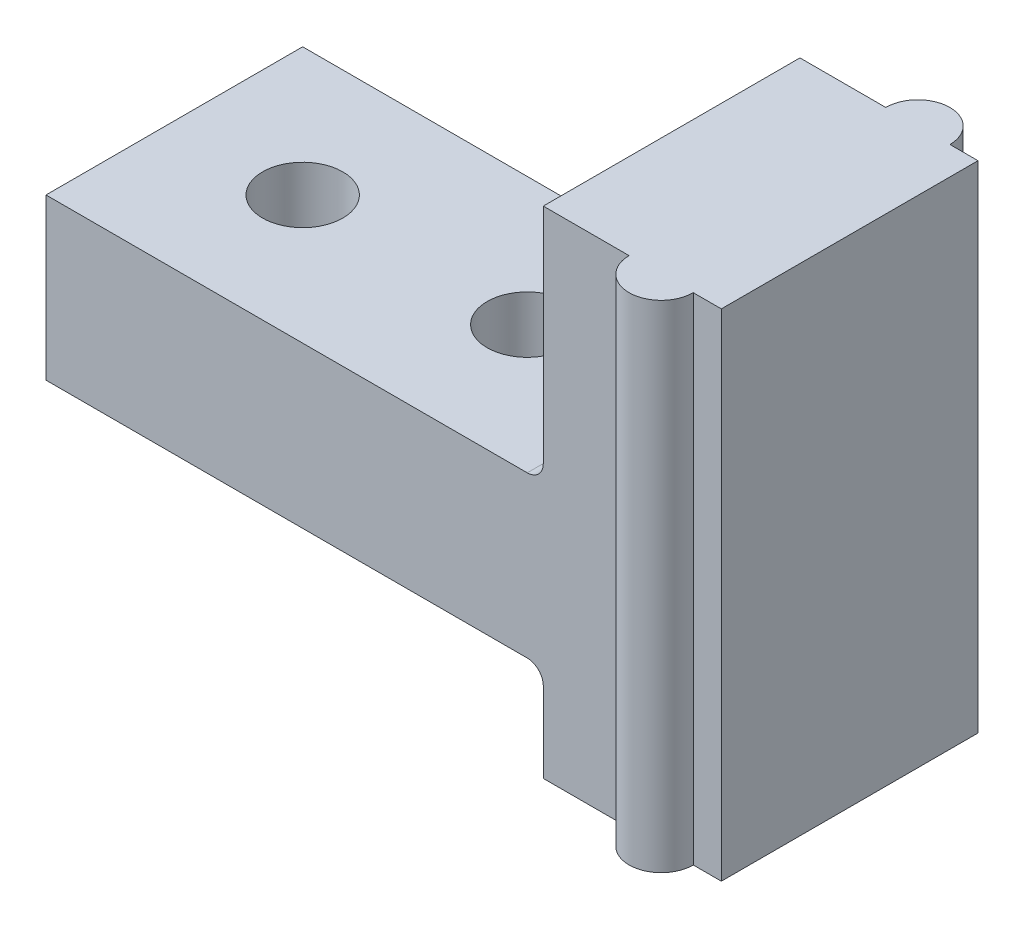
ISO-10303-21;
HEADER;
FILE_DESCRIPTION(('STEP AP214'),'2;1');
FILE_NAME('part.step','',(''),(''),'','','');
FILE_SCHEMA(('AUTOMOTIVE_DESIGN { 1 0 10303 214 1 1 1 1 }'));
ENDSEC;
DATA;
#1=APPLICATION_CONTEXT('core data for automotive mechanical design processes');
#2=APPLICATION_PROTOCOL_DEFINITION('international standard','automotive_design',2000,#1);
#3=PRODUCT_CONTEXT('',#1,'mechanical');
#4=PRODUCT('Part','Part','',(#3));
#5=PRODUCT_RELATED_PRODUCT_CATEGORY('part','',(#4));
#6=PRODUCT_DEFINITION_FORMATION('','',#4);
#7=PRODUCT_DEFINITION_CONTEXT('part definition',#1,'design');
#8=PRODUCT_DEFINITION('design','',#6,#7);
#9=PRODUCT_DEFINITION_SHAPE('','',#8);
#10=(LENGTH_UNIT() NAMED_UNIT(*) SI_UNIT(.MILLI.,.METRE.));
#11=(NAMED_UNIT(*) PLANE_ANGLE_UNIT() SI_UNIT($,.RADIAN.));
#12=(NAMED_UNIT(*) SI_UNIT($,.STERADIAN.) SOLID_ANGLE_UNIT());
#13=UNCERTAINTY_MEASURE_WITH_UNIT(LENGTH_MEASURE(1.E-05),#10,'distance_accuracy_value','');
#14=(GEOMETRIC_REPRESENTATION_CONTEXT(3) GLOBAL_UNCERTAINTY_ASSIGNED_CONTEXT((#13)) GLOBAL_UNIT_ASSIGNED_CONTEXT((#10,
#11,#12)) REPRESENTATION_CONTEXT('',''));
#15=CARTESIAN_POINT('',(0.,0.,0.));
#16=DIRECTION('',(0.,0.,1.));
#17=DIRECTION('',(1.,0.,0.));
#18=AXIS2_PLACEMENT_3D('',#15,#16,#17);
#19=CARTESIAN_POINT('',(-6.04999999999999,8.5,4.));
#20=DIRECTION('',(0.,0.,1.));
#21=DIRECTION('',(1.,0.,0.));
#22=AXIS2_PLACEMENT_3D('',#19,#20,#21);
#23=PLANE('',#22);
#24=DIRECTION('',(0.,-1.,0.));
#25=VECTOR('',#24,1.);
#26=CARTESIAN_POINT('',(-2.875,15.45,4.));
#27=LINE('',#26,#25);
#28=CARTESIAN_POINT('',(-2.875,15.45,4.));
#29=VERTEX_POINT('',#28);
#30=CARTESIAN_POINT('',(-2.875,0.,4.));
#31=VERTEX_POINT('',#30);
#32=EDGE_CURVE('E49',#29,#31,#27,.T.);
#33=ORIENTED_EDGE('',*,*,#32,.F.);
#34=DIRECTION('',(-1.,0.,0.));
#35=VECTOR('',#34,1.);
#36=CARTESIAN_POINT('',(-5.54999999999999,15.45,4.));
#37=LINE('',#36,#35);
#38=CARTESIAN_POINT('',(-5.54999999999999,15.45,4.));
#39=VERTEX_POINT('',#38);
#40=EDGE_CURVE('E174',#29,#39,#37,.T.);
#41=ORIENTED_EDGE('',*,*,#40,.T.);
#42=DIRECTION('',(0.,-1.,0.));
#43=VECTOR('',#42,1.);
#44=CARTESIAN_POINT('',(-5.54999999999999,8.5,4.));
#45=LINE('',#44,#43);
#46=CARTESIAN_POINT('',(-5.54999999999999,8.5,4.));
#47=VERTEX_POINT('',#46);
#48=EDGE_CURVE('E176',#39,#47,#45,.T.);
#49=ORIENTED_EDGE('',*,*,#48,.T.);
#50=CARTESIAN_POINT('',(-6.04999999999999,8.5,4.));
#51=DIRECTION('',(0.,0.,-1.));
#52=DIRECTION('',(1.,0.,0.));
#53=AXIS2_PLACEMENT_3D('',#50,#51,#52);
#54=CIRCLE('',#53,0.500000000000001);
#55=CARTESIAN_POINT('',(-6.04999999999999,8.,4.));
#56=VERTEX_POINT('',#55);
#57=EDGE_CURVE('E178',#47,#56,#54,.T.);
#58=ORIENTED_EDGE('',*,*,#57,.T.);
#59=DIRECTION('',(-1.,0.,0.));
#60=VECTOR('',#59,1.);
#61=CARTESIAN_POINT('',(-6.04999999999999,8.,4.));
#62=LINE('',#61,#60);
#63=CARTESIAN_POINT('',(-21.05,8.,4.));
#64=VERTEX_POINT('',#63);
#65=EDGE_CURVE('E180',#56,#64,#62,.T.);
#66=ORIENTED_EDGE('',*,*,#65,.T.);
#67=DIRECTION('',(0.,-1.,0.));
#68=VECTOR('',#67,1.);
#69=CARTESIAN_POINT('',(-21.05,3.,4.));
#70=LINE('',#69,#68);
#71=CARTESIAN_POINT('',(-21.05,3.,4.));
#72=VERTEX_POINT('',#71);
#73=EDGE_CURVE('E182',#64,#72,#70,.T.);
#74=ORIENTED_EDGE('',*,*,#73,.T.);
#75=DIRECTION('',(1.,0.,0.));
#76=VECTOR('',#75,1.);
#77=CARTESIAN_POINT('',(-6.04999999999999,3.,4.));
#78=LINE('',#77,#76);
#79=CARTESIAN_POINT('',(-6.04999999999999,3.,4.));
#80=VERTEX_POINT('',#79);
#81=EDGE_CURVE('E184',#72,#80,#78,.T.);
#82=ORIENTED_EDGE('',*,*,#81,.T.);
#83=CARTESIAN_POINT('',(-6.04999999999999,2.5,4.));
#84=DIRECTION('',(0.,0.,-1.));
#85=DIRECTION('',(-1.,0.,0.));
#86=AXIS2_PLACEMENT_3D('',#83,#84,#85);
#87=CIRCLE('',#86,0.500000000000003);
#88=CARTESIAN_POINT('',(-5.54999999999999,2.5,4.));
#89=VERTEX_POINT('',#88);
#90=EDGE_CURVE('E186',#80,#89,#87,.T.);
#91=ORIENTED_EDGE('',*,*,#90,.T.);
#92=DIRECTION('',(0.,-1.,0.));
#93=VECTOR('',#92,1.);
#94=CARTESIAN_POINT('',(-5.54999999999999,0.,4.));
#95=LINE('',#94,#93);
#96=CARTESIAN_POINT('',(-5.54999999999999,0.,4.));
#97=VERTEX_POINT('',#96);
#98=EDGE_CURVE('E188',#89,#97,#95,.T.);
#99=ORIENTED_EDGE('',*,*,#98,.T.);
#100=DIRECTION('',(1.,0.,0.));
#101=VECTOR('',#100,1.);
#102=CARTESIAN_POINT('',(-5.54999999999999,0.,4.));
#103=LINE('',#102,#101);
#104=EDGE_CURVE('E142',#97,#31,#103,.T.);
#105=ORIENTED_EDGE('',*,*,#104,.T.);
#106=EDGE_LOOP('',(#33,#41,#49,#58,#66,#74,#82,#91,#99,#105));
#107=FACE_BOUND('',#106,.T.);
#108=ADVANCED_FACE('F34',(#107),#23,.T.);
#109=CARTESIAN_POINT('',(-6.04999999999999,8.5,-4.));
#110=DIRECTION('',(0.,0.,1.));
#111=DIRECTION('',(1.,0.,0.));
#112=AXIS2_PLACEMENT_3D('',#109,#110,#111);
#113=PLANE('',#112);
#114=DIRECTION('',(-1.,0.,0.));
#115=VECTOR('',#114,1.);
#116=CARTESIAN_POINT('',(-5.54999999999999,15.45,-4.));
#117=LINE('',#116,#115);
#118=CARTESIAN_POINT('',(-2.875,15.45,-4.));
#119=VERTEX_POINT('',#118);
#120=CARTESIAN_POINT('',(-5.54999999999999,15.45,-4.));
#121=VERTEX_POINT('',#120);
#122=EDGE_CURVE('E195',#119,#121,#117,.T.);
#123=ORIENTED_EDGE('',*,*,#122,.F.);
#124=DIRECTION('',(0.,-1.,0.));
#125=VECTOR('',#124,1.);
#126=CARTESIAN_POINT('',(-2.875,15.45,-4.));
#127=LINE('',#126,#125);
#128=CARTESIAN_POINT('',(-2.875,0.,-4.));
#129=VERTEX_POINT('',#128);
#130=EDGE_CURVE('E166',#119,#129,#127,.T.);
#131=ORIENTED_EDGE('',*,*,#130,.T.);
#132=DIRECTION('',(1.,0.,0.));
#133=VECTOR('',#132,1.);
#134=CARTESIAN_POINT('',(-5.54999999999999,0.,-4.));
#135=LINE('',#134,#133);
#136=CARTESIAN_POINT('',(-5.54999999999999,0.,-4.));
#137=VERTEX_POINT('',#136);
#138=EDGE_CURVE('E191',#137,#129,#135,.T.);
#139=ORIENTED_EDGE('',*,*,#138,.F.);
#140=DIRECTION('',(0.,-1.,0.));
#141=VECTOR('',#140,1.);
#142=CARTESIAN_POINT('',(-5.54999999999999,0.,-4.));
#143=LINE('',#142,#141);
#144=CARTESIAN_POINT('',(-5.54999999999999,2.5,-4.));
#145=VERTEX_POINT('',#144);
#146=EDGE_CURVE('E143',#145,#137,#143,.T.);
#147=ORIENTED_EDGE('',*,*,#146,.F.);
#148=CARTESIAN_POINT('',(-6.04999999999999,2.5,-4.));
#149=DIRECTION('',(0.,0.,-1.));
#150=DIRECTION('',(-1.,0.,0.));
#151=AXIS2_PLACEMENT_3D('',#148,#149,#150);
#152=CIRCLE('',#151,0.500000000000003);
#153=CARTESIAN_POINT('',(-6.04999999999999,3.,-4.));
#154=VERTEX_POINT('',#153);
#155=EDGE_CURVE('E209',#154,#145,#152,.T.);
#156=ORIENTED_EDGE('',*,*,#155,.F.);
#157=DIRECTION('',(1.,0.,0.));
#158=VECTOR('',#157,1.);
#159=CARTESIAN_POINT('',(-6.04999999999999,3.,-4.));
#160=LINE('',#159,#158);
#161=CARTESIAN_POINT('',(-21.05,3.,-4.));
#162=VERTEX_POINT('',#161);
#163=EDGE_CURVE('E207',#162,#154,#160,.T.);
#164=ORIENTED_EDGE('',*,*,#163,.F.);
#165=DIRECTION('',(0.,-1.,0.));
#166=VECTOR('',#165,1.);
#167=CARTESIAN_POINT('',(-21.05,3.,-4.));
#168=LINE('',#167,#166);
#169=CARTESIAN_POINT('',(-21.05,8.,-4.));
#170=VERTEX_POINT('',#169);
#171=EDGE_CURVE('E205',#170,#162,#168,.T.);
#172=ORIENTED_EDGE('',*,*,#171,.F.);
#173=DIRECTION('',(-1.,0.,0.));
#174=VECTOR('',#173,1.);
#175=CARTESIAN_POINT('',(-6.04999999999999,8.,-4.));
#176=LINE('',#175,#174);
#177=CARTESIAN_POINT('',(-6.04999999999999,8.,-4.));
#178=VERTEX_POINT('',#177);
#179=EDGE_CURVE('E203',#178,#170,#176,.T.);
#180=ORIENTED_EDGE('',*,*,#179,.F.);
#181=CARTESIAN_POINT('',(-6.04999999999999,8.5,-4.));
#182=DIRECTION('',(0.,0.,-1.));
#183=DIRECTION('',(1.,0.,0.));
#184=AXIS2_PLACEMENT_3D('',#181,#182,#183);
#185=CIRCLE('',#184,0.500000000000001);
#186=CARTESIAN_POINT('',(-5.54999999999999,8.5,-4.));
#187=VERTEX_POINT('',#186);
#188=EDGE_CURVE('E201',#187,#178,#185,.T.);
#189=ORIENTED_EDGE('',*,*,#188,.F.);
#190=DIRECTION('',(0.,-1.,0.));
#191=VECTOR('',#190,1.);
#192=CARTESIAN_POINT('',(-5.54999999999999,8.5,-4.));
#193=LINE('',#192,#191);
#194=EDGE_CURVE('E199',#121,#187,#193,.T.);
#195=ORIENTED_EDGE('',*,*,#194,.F.);
#196=EDGE_LOOP('',(#123,#131,#139,#147,#156,#164,#172,#180,#189,#195));
#197=FACE_BOUND('',#196,.T.);
#198=ADVANCED_FACE('F252',(#197),#113,.F.);
#199=CARTESIAN_POINT('',(-5.54999999999999,0.,4.));
#200=DIRECTION('',(0.,1.,0.));
#201=DIRECTION('',(0.,0.,1.));
#202=AXIS2_PLACEMENT_3D('',#199,#200,#201);
#203=PLANE('',#202);
#204=ORIENTED_EDGE('',*,*,#138,.T.);
#205=CARTESIAN_POINT('',(-1.875,0.,-4.));
#206=DIRECTION('',(0.,-1.,0.));
#207=DIRECTION('',(0.,0.,1.));
#208=AXIS2_PLACEMENT_3D('',#205,#206,#207);
#209=CIRCLE('',#208,1.);
#210=CARTESIAN_POINT('',(-0.874999999999999,0.,-4.));
#211=VERTEX_POINT('',#210);
#212=EDGE_CURVE('E150',#129,#211,#209,.T.);
#213=ORIENTED_EDGE('',*,*,#212,.T.);
#214=CARTESIAN_POINT('',(0.,0.,-4.));
#215=VERTEX_POINT('',#214);
#216=EDGE_CURVE('E169',#211,#215,#135,.T.);
#217=ORIENTED_EDGE('',*,*,#216,.T.);
#218=DIRECTION('',(0.,0.,-1.));
#219=VECTOR('',#218,1.);
#220=CARTESIAN_POINT('',(0.,0.,4.));
#221=LINE('',#220,#219);
#222=CARTESIAN_POINT('',(0.,0.,4.));
#223=VERTEX_POINT('',#222);
#224=EDGE_CURVE('E11',#223,#215,#221,.T.);
#225=ORIENTED_EDGE('',*,*,#224,.F.);
#226=CARTESIAN_POINT('',(-0.875,0.,4.));
#227=VERTEX_POINT('',#226);
#228=EDGE_CURVE('E136',#227,#223,#103,.T.);
#229=ORIENTED_EDGE('',*,*,#228,.F.);
#230=CARTESIAN_POINT('',(-1.875,0.,4.));
#231=DIRECTION('',(0.,-1.,0.));
#232=DIRECTION('',(0.,0.,-1.));
#233=AXIS2_PLACEMENT_3D('',#230,#231,#232);
#234=CIRCLE('',#233,1.);
#235=EDGE_CURVE('E140',#227,#31,#234,.T.);
#236=ORIENTED_EDGE('',*,*,#235,.T.);
#237=ORIENTED_EDGE('',*,*,#104,.F.);
#238=DIRECTION('',(0.,0.,-1.));
#239=VECTOR('',#238,1.);
#240=CARTESIAN_POINT('',(-5.54999999999999,0.,4.));
#241=LINE('',#240,#239);
#242=EDGE_CURVE('E190',#97,#137,#241,.T.);
#243=ORIENTED_EDGE('',*,*,#242,.T.);
#244=EDGE_LOOP('',(#204,#213,#217,#225,#229,#236,#237,#243));
#245=FACE_BOUND('',#244,.T.);
#246=ADVANCED_FACE('F36',(#245),#203,.F.);
#247=CARTESIAN_POINT('',(0.,0.,4.));
#248=DIRECTION('',(-1.,0.,0.));
#249=DIRECTION('',(0.,0.,1.));
#250=AXIS2_PLACEMENT_3D('',#247,#248,#249);
#251=PLANE('',#250);
#252=DIRECTION('',(0.,1.,0.));
#253=VECTOR('',#252,1.);
#254=CARTESIAN_POINT('',(0.,0.,-4.));
#255=LINE('',#254,#253);
#256=CARTESIAN_POINT('',(0.,15.45,-4.));
#257=VERTEX_POINT('',#256);
#258=EDGE_CURVE('E193',#215,#257,#255,.T.);
#259=ORIENTED_EDGE('',*,*,#258,.T.);
#260=DIRECTION('',(0.,0.,-1.));
#261=VECTOR('',#260,1.);
#262=CARTESIAN_POINT('',(0.,15.45,4.));
#263=LINE('',#262,#261);
#264=CARTESIAN_POINT('',(0.,15.45,4.));
#265=VERTEX_POINT('',#264);
#266=EDGE_CURVE('E42',#265,#257,#263,.T.);
#267=ORIENTED_EDGE('',*,*,#266,.F.);
#268=DIRECTION('',(0.,1.,0.));
#269=VECTOR('',#268,1.);
#270=CARTESIAN_POINT('',(0.,0.,4.));
#271=LINE('',#270,#269);
#272=EDGE_CURVE('E172',#223,#265,#271,.T.);
#273=ORIENTED_EDGE('',*,*,#272,.F.);
#274=ORIENTED_EDGE('',*,*,#224,.T.);
#275=EDGE_LOOP('',(#259,#267,#273,#274));
#276=FACE_BOUND('',#275,.T.);
#277=ADVANCED_FACE('F352',(#276),#251,.F.);
#278=CARTESIAN_POINT('',(-5.54999999999999,15.45,4.));
#279=DIRECTION('',(0.,-1.,0.));
#280=DIRECTION('',(0.,0.,-1.));
#281=AXIS2_PLACEMENT_3D('',#278,#279,#280);
#282=PLANE('',#281);
#283=CARTESIAN_POINT('',(-0.875,15.45,-4.));
#284=VERTEX_POINT('',#283);
#285=EDGE_CURVE('E196',#257,#284,#117,.T.);
#286=ORIENTED_EDGE('',*,*,#285,.T.);
#287=CARTESIAN_POINT('',(-1.875,15.45,-4.));
#288=DIRECTION('',(0.,-1.,0.));
#289=DIRECTION('',(0.,0.,1.));
#290=AXIS2_PLACEMENT_3D('',#287,#288,#289);
#291=CIRCLE('',#290,1.);
#292=EDGE_CURVE('E162',#119,#284,#291,.T.);
#293=ORIENTED_EDGE('',*,*,#292,.F.);
#294=ORIENTED_EDGE('',*,*,#122,.T.);
#295=DIRECTION('',(0.,0.,-1.));
#296=VECTOR('',#295,1.);
#297=CARTESIAN_POINT('',(-5.54999999999999,15.45,4.));
#298=LINE('',#297,#296);
#299=EDGE_CURVE('E232',#39,#121,#298,.T.);
#300=ORIENTED_EDGE('',*,*,#299,.F.);
#301=ORIENTED_EDGE('',*,*,#40,.F.);
#302=CARTESIAN_POINT('',(-1.875,15.45,4.));
#303=DIRECTION('',(0.,-1.,0.));
#304=DIRECTION('',(0.,0.,-1.));
#305=AXIS2_PLACEMENT_3D('',#302,#303,#304);
#306=CIRCLE('',#305,1.);
#307=CARTESIAN_POINT('',(-0.875,15.45,4.));
#308=VERTEX_POINT('',#307);
#309=EDGE_CURVE('E153',#308,#29,#306,.T.);
#310=ORIENTED_EDGE('',*,*,#309,.F.);
#311=EDGE_CURVE('E57',#265,#308,#37,.T.);
#312=ORIENTED_EDGE('',*,*,#311,.F.);
#313=ORIENTED_EDGE('',*,*,#266,.T.);
#314=EDGE_LOOP('',(#286,#293,#294,#300,#301,#310,#312,#313));
#315=FACE_BOUND('',#314,.T.);
#316=ADVANCED_FACE('F238',(#315),#282,.F.);
#317=CARTESIAN_POINT('',(-5.54999999999999,8.5,4.));
#318=DIRECTION('',(1.,0.,0.));
#319=DIRECTION('',(0.,1.,0.));
#320=AXIS2_PLACEMENT_3D('',#317,#318,#319);
#321=PLANE('',#320);
#322=ORIENTED_EDGE('',*,*,#194,.T.);
#323=DIRECTION('',(0.,0.,-1.));
#324=VECTOR('',#323,1.);
#325=CARTESIAN_POINT('',(-5.54999999999999,8.5,4.));
#326=LINE('',#325,#324);
#327=EDGE_CURVE('E229',#47,#187,#326,.T.);
#328=ORIENTED_EDGE('',*,*,#327,.F.);
#329=ORIENTED_EDGE('',*,*,#48,.F.);
#330=ORIENTED_EDGE('',*,*,#299,.T.);
#331=EDGE_LOOP('',(#322,#328,#329,#330));
#332=FACE_BOUND('',#331,.T.);
#333=ADVANCED_FACE('F258',(#332),#321,.F.);
#334=CARTESIAN_POINT('',(-6.04999999999999,8.5,4.));
#335=DIRECTION('',(0.,0.,-1.));
#336=DIRECTION('',(-1.,0.,0.));
#337=AXIS2_PLACEMENT_3D('',#334,#335,#336);
#338=CYLINDRICAL_SURFACE('',#337,0.500000000000001);
#339=ORIENTED_EDGE('',*,*,#188,.T.);
#340=DIRECTION('',(0.,0.,-1.));
#341=VECTOR('',#340,1.);
#342=CARTESIAN_POINT('',(-6.04999999999999,8.,4.));
#343=LINE('',#342,#341);
#344=EDGE_CURVE('E226',#56,#178,#343,.T.);
#345=ORIENTED_EDGE('',*,*,#344,.F.);
#346=ORIENTED_EDGE('',*,*,#57,.F.);
#347=ORIENTED_EDGE('',*,*,#327,.T.);
#348=EDGE_LOOP('',(#339,#345,#346,#347));
#349=FACE_BOUND('',#348,.T.);
#350=ADVANCED_FACE('F262',(#349),#338,.F.);
#351=CARTESIAN_POINT('',(-6.04999999999999,8.,4.));
#352=DIRECTION('',(0.,-1.,0.));
#353=DIRECTION('',(1.,0.,0.));
#354=AXIS2_PLACEMENT_3D('',#351,#352,#353);
#355=PLANE('',#354);
#356=CARTESIAN_POINT('',(-17.05,8.,0.));
#357=DIRECTION('',(0.,-1.,0.));
#358=DIRECTION('',(1.,0.,0.));
#359=AXIS2_PLACEMENT_3D('',#356,#357,#358);
#360=CIRCLE('',#359,1.24999999999999);
#361=CARTESIAN_POINT('',(-15.8,8.,0.));
#362=VERTEX_POINT('',#361);
#363=EDGE_CURVE('E328',#362,#362,#360,.T.);
#364=ORIENTED_EDGE('',*,*,#363,.T.);
#365=EDGE_LOOP('',(#364));
#366=FACE_BOUND('',#365,.T.);
#367=CARTESIAN_POINT('',(-10.05,8.,0.));
#368=DIRECTION('',(0.,-1.,0.));
#369=DIRECTION('',(1.,0.,0.));
#370=AXIS2_PLACEMENT_3D('',#367,#368,#369);
#371=CIRCLE('',#370,1.24999999999999);
#372=CARTESIAN_POINT('',(-8.8,8.,0.));
#373=VERTEX_POINT('',#372);
#374=EDGE_CURVE('E154',#373,#373,#371,.T.);
#375=ORIENTED_EDGE('',*,*,#374,.T.);
#376=EDGE_LOOP('',(#375));
#377=FACE_BOUND('',#376,.T.);
#378=ORIENTED_EDGE('',*,*,#179,.T.);
#379=DIRECTION('',(0.,0.,-1.));
#380=VECTOR('',#379,1.);
#381=CARTESIAN_POINT('',(-21.05,8.,4.));
#382=LINE('',#381,#380);
#383=EDGE_CURVE('E223',#64,#170,#382,.T.);
#384=ORIENTED_EDGE('',*,*,#383,.F.);
#385=ORIENTED_EDGE('',*,*,#65,.F.);
#386=ORIENTED_EDGE('',*,*,#344,.T.);
#387=EDGE_LOOP('',(#378,#384,#385,#386));
#388=FACE_BOUND('',#387,.T.);
#389=ADVANCED_FACE('F269',(#366,#377,#388),#355,.F.);
#390=CARTESIAN_POINT('',(-21.05,3.,4.));
#391=DIRECTION('',(1.,0.,0.));
#392=DIRECTION('',(0.,1.,0.));
#393=AXIS2_PLACEMENT_3D('',#390,#391,#392);
#394=PLANE('',#393);
#395=ORIENTED_EDGE('',*,*,#171,.T.);
#396=DIRECTION('',(0.,0.,-1.));
#397=VECTOR('',#396,1.);
#398=CARTESIAN_POINT('',(-21.05,3.,4.));
#399=LINE('',#398,#397);
#400=EDGE_CURVE('E220',#72,#162,#399,.T.);
#401=ORIENTED_EDGE('',*,*,#400,.F.);
#402=ORIENTED_EDGE('',*,*,#73,.F.);
#403=ORIENTED_EDGE('',*,*,#383,.T.);
#404=EDGE_LOOP('',(#395,#401,#402,#403));
#405=FACE_BOUND('',#404,.T.);
#406=ADVANCED_FACE('F272',(#405),#394,.F.);
#407=CARTESIAN_POINT('',(-6.04999999999999,3.,4.));
#408=DIRECTION('',(0.,1.,0.));
#409=DIRECTION('',(-1.,0.,0.));
#410=AXIS2_PLACEMENT_3D('',#407,#408,#409);
#411=PLANE('',#410);
#412=CARTESIAN_POINT('',(-17.05,3.,0.));
#413=DIRECTION('',(0.,-1.,0.));
#414=DIRECTION('',(0.,0.,-1.));
#415=AXIS2_PLACEMENT_3D('',#412,#413,#414);
#416=CIRCLE('',#415,1.24999999999999);
#417=CARTESIAN_POINT('',(-17.05,3.,-1.24999999999999));
#418=VERTEX_POINT('',#417);
#419=EDGE_CURVE('E325',#418,#418,#416,.T.);
#420=ORIENTED_EDGE('',*,*,#419,.F.);
#421=EDGE_LOOP('',(#420));
#422=FACE_BOUND('',#421,.T.);
#423=CARTESIAN_POINT('',(-10.05,3.,0.));
#424=DIRECTION('',(0.,-1.,0.));
#425=DIRECTION('',(0.,0.,-1.));
#426=AXIS2_PLACEMENT_3D('',#423,#424,#425);
#427=CIRCLE('',#426,1.24999999999999);
#428=CARTESIAN_POINT('',(-10.05,3.,-1.24999999999999));
#429=VERTEX_POINT('',#428);
#430=EDGE_CURVE('E158',#429,#429,#427,.T.);
#431=ORIENTED_EDGE('',*,*,#430,.F.);
#432=EDGE_LOOP('',(#431));
#433=FACE_BOUND('',#432,.T.);
#434=ORIENTED_EDGE('',*,*,#163,.T.);
#435=DIRECTION('',(0.,0.,-1.));
#436=VECTOR('',#435,1.);
#437=CARTESIAN_POINT('',(-6.04999999999999,3.,4.));
#438=LINE('',#437,#436);
#439=EDGE_CURVE('E217',#80,#154,#438,.T.);
#440=ORIENTED_EDGE('',*,*,#439,.F.);
#441=ORIENTED_EDGE('',*,*,#81,.F.);
#442=ORIENTED_EDGE('',*,*,#400,.T.);
#443=EDGE_LOOP('',(#434,#440,#441,#442));
#444=FACE_BOUND('',#443,.T.);
#445=ADVANCED_FACE('F277',(#422,#433,#444),#411,.F.);
#446=CARTESIAN_POINT('',(-6.04999999999999,2.5,4.));
#447=DIRECTION('',(0.,0.,-1.));
#448=DIRECTION('',(-1.,0.,0.));
#449=AXIS2_PLACEMENT_3D('',#446,#447,#448);
#450=CYLINDRICAL_SURFACE('',#449,0.500000000000003);
#451=ORIENTED_EDGE('',*,*,#155,.T.);
#452=DIRECTION('',(0.,0.,-1.));
#453=VECTOR('',#452,1.);
#454=CARTESIAN_POINT('',(-5.54999999999999,2.5,4.));
#455=LINE('',#454,#453);
#456=EDGE_CURVE('E214',#89,#145,#455,.T.);
#457=ORIENTED_EDGE('',*,*,#456,.F.);
#458=ORIENTED_EDGE('',*,*,#90,.F.);
#459=ORIENTED_EDGE('',*,*,#439,.T.);
#460=EDGE_LOOP('',(#451,#457,#458,#459));
#461=FACE_BOUND('',#460,.T.);
#462=ADVANCED_FACE('F283',(#461),#450,.F.);
#463=CARTESIAN_POINT('',(-5.54999999999999,0.,4.));
#464=DIRECTION('',(1.,0.,0.));
#465=DIRECTION('',(0.,1.,0.));
#466=AXIS2_PLACEMENT_3D('',#463,#464,#465);
#467=PLANE('',#466);
#468=ORIENTED_EDGE('',*,*,#146,.T.);
#469=ORIENTED_EDGE('',*,*,#242,.F.);
#470=ORIENTED_EDGE('',*,*,#98,.F.);
#471=ORIENTED_EDGE('',*,*,#456,.T.);
#472=EDGE_LOOP('',(#468,#469,#470,#471));
#473=FACE_BOUND('',#472,.T.);
#474=ADVANCED_FACE('F287',(#473),#467,.F.);
#475=DIRECTION('',(0.,-1.,0.));
#476=VECTOR('',#475,1.);
#477=CARTESIAN_POINT('',(-0.875,15.45,4.));
#478=LINE('',#477,#476);
#479=EDGE_CURVE('E145',#308,#227,#478,.T.);
#480=ORIENTED_EDGE('',*,*,#479,.T.);
#481=ORIENTED_EDGE('',*,*,#228,.T.);
#482=ORIENTED_EDGE('',*,*,#272,.T.);
#483=ORIENTED_EDGE('',*,*,#311,.T.);
#484=EDGE_LOOP('',(#480,#481,#482,#483));
#485=FACE_BOUND('',#484,.T.);
#486=ADVANCED_FACE('F146',(#485),#23,.T.);
#487=ORIENTED_EDGE('',*,*,#216,.F.);
#488=DIRECTION('',(0.,-1.,0.));
#489=VECTOR('',#488,1.);
#490=CARTESIAN_POINT('',(-0.875,15.45,-4.));
#491=LINE('',#490,#489);
#492=EDGE_CURVE('E164',#284,#211,#491,.T.);
#493=ORIENTED_EDGE('',*,*,#492,.F.);
#494=ORIENTED_EDGE('',*,*,#285,.F.);
#495=ORIENTED_EDGE('',*,*,#258,.F.);
#496=EDGE_LOOP('',(#487,#493,#494,#495));
#497=FACE_BOUND('',#496,.T.);
#498=ADVANCED_FACE('F245',(#497),#113,.F.);
#499=CARTESIAN_POINT('',(-1.875,15.45,-4.));
#500=DIRECTION('',(0.,-1.,0.));
#501=DIRECTION('',(0.,0.,-1.));
#502=AXIS2_PLACEMENT_3D('',#499,#500,#501);
#503=CYLINDRICAL_SURFACE('',#502,1.);
#504=ORIENTED_EDGE('',*,*,#212,.F.);
#505=ORIENTED_EDGE('',*,*,#130,.F.);
#506=ORIENTED_EDGE('',*,*,#292,.T.);
#507=ORIENTED_EDGE('',*,*,#492,.T.);
#508=EDGE_LOOP('',(#504,#505,#506,#507));
#509=FACE_BOUND('',#508,.T.);
#510=ADVANCED_FACE('F247',(#509),#503,.T.);
#511=CARTESIAN_POINT('',(-1.875,15.45,4.));
#512=DIRECTION('',(0.,-1.,0.));
#513=DIRECTION('',(0.,0.,-1.));
#514=AXIS2_PLACEMENT_3D('',#511,#512,#513);
#515=CYLINDRICAL_SURFACE('',#514,1.);
#516=ORIENTED_EDGE('',*,*,#235,.F.);
#517=ORIENTED_EDGE('',*,*,#479,.F.);
#518=ORIENTED_EDGE('',*,*,#309,.T.);
#519=ORIENTED_EDGE('',*,*,#32,.T.);
#520=EDGE_LOOP('',(#516,#517,#518,#519));
#521=FACE_BOUND('',#520,.T.);
#522=ADVANCED_FACE('F152',(#521),#515,.T.);
#523=CARTESIAN_POINT('',(-10.05,3.,0.));
#524=DIRECTION('',(0.,-1.,0.));
#525=DIRECTION('',(0.,0.,-1.));
#526=AXIS2_PLACEMENT_3D('',#523,#524,#525);
#527=CYLINDRICAL_SURFACE('',#526,1.24999999999999);
#528=ORIENTED_EDGE('',*,*,#430,.T.);
#529=EDGE_LOOP('',(#528));
#530=FACE_BOUND('',#529,.T.);
#531=ORIENTED_EDGE('',*,*,#374,.F.);
#532=EDGE_LOOP('',(#531));
#533=FACE_BOUND('',#532,.T.);
#534=ADVANCED_FACE('F310',(#530,#533),#527,.F.);
#535=CARTESIAN_POINT('',(-17.05,3.,0.));
#536=DIRECTION('',(0.,-1.,0.));
#537=DIRECTION('',(0.,0.,-1.));
#538=AXIS2_PLACEMENT_3D('',#535,#536,#537);
#539=CYLINDRICAL_SURFACE('',#538,1.24999999999999);
#540=ORIENTED_EDGE('',*,*,#419,.T.);
#541=EDGE_LOOP('',(#540));
#542=FACE_BOUND('',#541,.T.);
#543=ORIENTED_EDGE('',*,*,#363,.F.);
#544=EDGE_LOOP('',(#543));
#545=FACE_BOUND('',#544,.T.);
#546=ADVANCED_FACE('F314',(#542,#545),#539,.F.);
#547=CLOSED_SHELL('',(#108,#198,#246,#277,#316,#333,#350,#389,#406,#445,#462,#474,#486,#498,
#510,#522,#534,#546));
#548=MANIFOLD_SOLID_BREP('B2',#547);
#549=ADVANCED_BREP_SHAPE_REPRESENTATION('',(#18,#548),#14);
#550=SHAPE_DEFINITION_REPRESENTATION(#9,#549);
ENDSEC;
END-ISO-10303-21;
